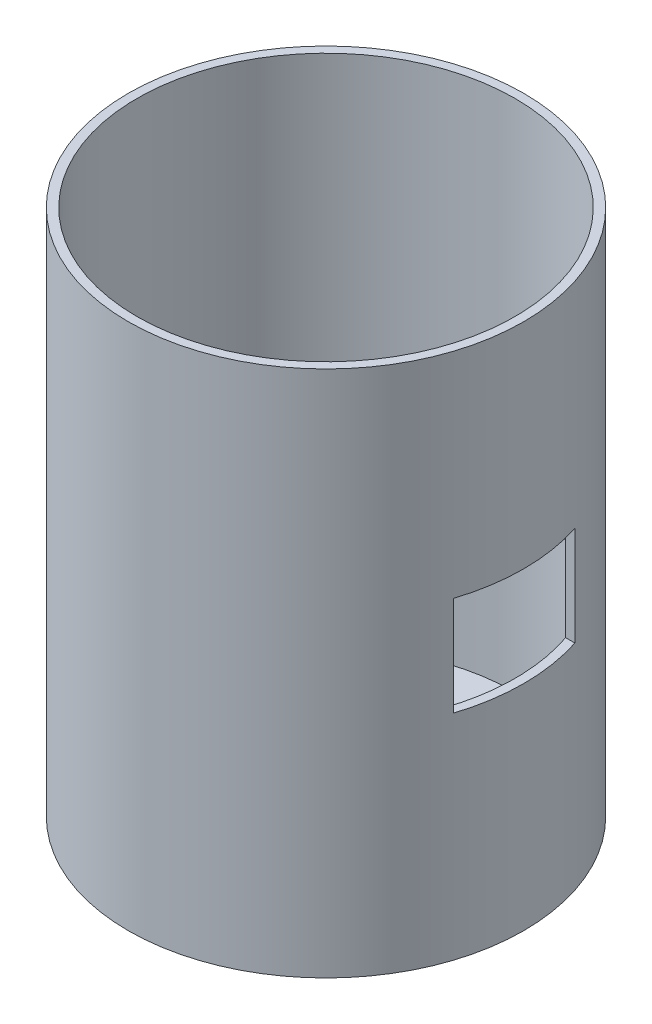
ISO-10303-21;
HEADER;
FILE_DESCRIPTION(('STEP AP214'),'2;1');
FILE_NAME('part.step','',(''),(''),'','','');
FILE_SCHEMA(('AUTOMOTIVE_DESIGN { 1 0 10303 214 1 1 1 1 }'));
ENDSEC;
DATA;
#1=APPLICATION_CONTEXT('core data for automotive mechanical design processes');
#2=APPLICATION_PROTOCOL_DEFINITION('international standard','automotive_design',2000,#1);
#3=PRODUCT_CONTEXT('',#1,'mechanical');
#4=PRODUCT('Part','Part','',(#3));
#5=PRODUCT_RELATED_PRODUCT_CATEGORY('part','',(#4));
#6=PRODUCT_DEFINITION_FORMATION('','',#4);
#7=PRODUCT_DEFINITION_CONTEXT('part definition',#1,'design');
#8=PRODUCT_DEFINITION('design','',#6,#7);
#9=PRODUCT_DEFINITION_SHAPE('','',#8);
#10=(LENGTH_UNIT() NAMED_UNIT(*) SI_UNIT(.MILLI.,.METRE.));
#11=(NAMED_UNIT(*) PLANE_ANGLE_UNIT() SI_UNIT($,.RADIAN.));
#12=(NAMED_UNIT(*) SI_UNIT($,.STERADIAN.) SOLID_ANGLE_UNIT());
#13=UNCERTAINTY_MEASURE_WITH_UNIT(LENGTH_MEASURE(1.E-05),#10,'distance_accuracy_value','');
#14=(GEOMETRIC_REPRESENTATION_CONTEXT(3) GLOBAL_UNCERTAINTY_ASSIGNED_CONTEXT((#13)) GLOBAL_UNIT_ASSIGNED_CONTEXT((#10,
#11,#12)) REPRESENTATION_CONTEXT('',''));
#15=CARTESIAN_POINT('',(0.,0.,0.));
#16=DIRECTION('',(0.,0.,1.));
#17=DIRECTION('',(1.,0.,0.));
#18=AXIS2_PLACEMENT_3D('',#15,#16,#17);
#19=CARTESIAN_POINT('',(0.,120.,0.));
#20=DIRECTION('',(0.,-1.,0.));
#21=DIRECTION('',(0.,0.,-1.));
#22=AXIS2_PLACEMENT_3D('',#19,#20,#21);
#23=CYLINDRICAL_SURFACE('',#22,45.);
#24=CARTESIAN_POINT('',(0.,0.,0.));
#25=DIRECTION('',(0.,1.,0.));
#26=DIRECTION('',(0.,0.,1.));
#27=AXIS2_PLACEMENT_3D('',#24,#25,#26);
#28=CIRCLE('',#27,45.);
#29=CARTESIAN_POINT('',(0.,0.,45.));
#30=VERTEX_POINT('',#29);
#31=EDGE_CURVE('E113',#30,#30,#28,.T.);
#32=ORIENTED_EDGE('',*,*,#31,.T.);
#33=EDGE_LOOP('',(#32));
#34=FACE_BOUND('',#33,.T.);
#35=CARTESIAN_POINT('',(0.,120.,0.));
#36=DIRECTION('',(0.,1.,0.));
#37=DIRECTION('',(0.,0.,1.));
#38=AXIS2_PLACEMENT_3D('',#35,#36,#37);
#39=CIRCLE('',#38,45.);
#40=CARTESIAN_POINT('',(0.,120.,45.));
#41=VERTEX_POINT('',#40);
#42=EDGE_CURVE('E120',#41,#41,#39,.T.);
#43=ORIENTED_EDGE('',*,*,#42,.F.);
#44=EDGE_LOOP('',(#43));
#45=FACE_BOUND('',#44,.T.);
#46=DIRECTION('',(0.,-1.,0.));
#47=VECTOR('',#46,1.);
#48=CARTESIAN_POINT('',(42.8317639141794,120.,13.8));
#49=LINE('',#48,#47);
#50=CARTESIAN_POINT('',(42.8317639141794,71.3,13.8));
#51=VERTEX_POINT('',#50);
#52=CARTESIAN_POINT('',(42.8317639141794,48.7,13.8));
#53=VERTEX_POINT('',#52);
#54=EDGE_CURVE('E94',#51,#53,#49,.T.);
#55=ORIENTED_EDGE('',*,*,#54,.F.);
#56=CARTESIAN_POINT('',(0.,71.3,0.));
#57=DIRECTION('',(0.,-1.,0.));
#58=DIRECTION('',(0.,0.,-1.));
#59=AXIS2_PLACEMENT_3D('',#56,#57,#58);
#60=CIRCLE('',#59,45.);
#61=CARTESIAN_POINT('',(42.8317639141794,71.3,-13.8));
#62=VERTEX_POINT('',#61);
#63=EDGE_CURVE('E82',#62,#51,#60,.T.);
#64=ORIENTED_EDGE('',*,*,#63,.F.);
#65=DIRECTION('',(0.,-1.,0.));
#66=VECTOR('',#65,1.);
#67=CARTESIAN_POINT('',(42.8317639141794,120.,-13.8));
#68=LINE('',#67,#66);
#69=CARTESIAN_POINT('',(42.8317639141794,48.7,-13.8));
#70=VERTEX_POINT('',#69);
#71=EDGE_CURVE('E86',#70,#62,#68,.F.);
#72=ORIENTED_EDGE('',*,*,#71,.F.);
#73=CARTESIAN_POINT('',(0.,48.7,0.));
#74=DIRECTION('',(0.,1.,0.));
#75=DIRECTION('',(0.,0.,1.));
#76=AXIS2_PLACEMENT_3D('',#73,#74,#75);
#77=CIRCLE('',#76,45.);
#78=EDGE_CURVE('E101',#53,#70,#77,.T.);
#79=ORIENTED_EDGE('',*,*,#78,.F.);
#80=EDGE_LOOP('',(#55,#64,#72,#79));
#81=FACE_BOUND('',#80,.T.);
#82=ADVANCED_FACE('F44',(#34,#45,#81),#23,.T.);
#83=CARTESIAN_POINT('',(0.,2.99999999999999,0.));
#84=DIRECTION('',(0.,1.,0.));
#85=DIRECTION('',(0.,0.,1.));
#86=AXIS2_PLACEMENT_3D('',#83,#84,#85);
#87=CYLINDRICAL_SURFACE('',#86,43.);
#88=CARTESIAN_POINT('',(0.,120.,0.));
#89=DIRECTION('',(0.,1.,0.));
#90=DIRECTION('',(0.,0.,1.));
#91=AXIS2_PLACEMENT_3D('',#88,#89,#90);
#92=CIRCLE('',#91,43.);
#93=CARTESIAN_POINT('',(0.,120.,43.));
#94=VERTEX_POINT('',#93);
#95=EDGE_CURVE('E103',#94,#94,#92,.T.);
#96=ORIENTED_EDGE('',*,*,#95,.T.);
#97=EDGE_LOOP('',(#96));
#98=FACE_BOUND('',#97,.T.);
#99=CARTESIAN_POINT('',(0.,2.99999999999999,0.));
#100=DIRECTION('',(0.,1.,0.));
#101=DIRECTION('',(0.,0.,1.));
#102=AXIS2_PLACEMENT_3D('',#99,#100,#101);
#103=CIRCLE('',#102,43.);
#104=CARTESIAN_POINT('',(0.,2.99999999999999,43.));
#105=VERTEX_POINT('',#104);
#106=EDGE_CURVE('E107',#105,#105,#103,.T.);
#107=ORIENTED_EDGE('',*,*,#106,.F.);
#108=EDGE_LOOP('',(#107));
#109=FACE_BOUND('',#108,.T.);
#110=DIRECTION('',(0.,1.,0.));
#111=VECTOR('',#110,1.);
#112=CARTESIAN_POINT('',(40.7254220358734,2.99999999999999,13.8));
#113=LINE('',#112,#111);
#114=CARTESIAN_POINT('',(40.7254220358734,48.7,13.8));
#115=VERTEX_POINT('',#114);
#116=CARTESIAN_POINT('',(40.7254220358734,71.3,13.8));
#117=VERTEX_POINT('',#116);
#118=EDGE_CURVE('E11',#115,#117,#113,.T.);
#119=ORIENTED_EDGE('',*,*,#118,.F.);
#120=CARTESIAN_POINT('',(0.,48.7,0.));
#121=DIRECTION('',(0.,1.,0.));
#122=DIRECTION('',(0.,0.,1.));
#123=AXIS2_PLACEMENT_3D('',#120,#121,#122);
#124=CIRCLE('',#123,43.);
#125=CARTESIAN_POINT('',(40.7254220358734,48.7,-13.8));
#126=VERTEX_POINT('',#125);
#127=EDGE_CURVE('E52',#126,#115,#124,.F.);
#128=ORIENTED_EDGE('',*,*,#127,.F.);
#129=DIRECTION('',(0.,1.,0.));
#130=VECTOR('',#129,1.);
#131=CARTESIAN_POINT('',(40.7254220358734,2.99999999999999,-13.8));
#132=LINE('',#131,#130);
#133=CARTESIAN_POINT('',(40.7254220358734,71.3,-13.8));
#134=VERTEX_POINT('',#133);
#135=EDGE_CURVE('E130',#134,#126,#132,.F.);
#136=ORIENTED_EDGE('',*,*,#135,.F.);
#137=CARTESIAN_POINT('',(0.,71.3,0.));
#138=DIRECTION('',(0.,-1.,0.));
#139=DIRECTION('',(0.,0.,-1.));
#140=AXIS2_PLACEMENT_3D('',#137,#138,#139);
#141=CIRCLE('',#140,43.);
#142=EDGE_CURVE('E121',#117,#134,#141,.F.);
#143=ORIENTED_EDGE('',*,*,#142,.F.);
#144=EDGE_LOOP('',(#119,#128,#136,#143));
#145=FACE_BOUND('',#144,.T.);
#146=ADVANCED_FACE('F140',(#98,#109,#145),#87,.F.);
#147=CARTESIAN_POINT('',(0.,120.,0.));
#148=DIRECTION('',(0.,1.,0.));
#149=DIRECTION('',(0.,0.,1.));
#150=AXIS2_PLACEMENT_3D('',#147,#148,#149);
#151=PLANE('',#150);
#152=ORIENTED_EDGE('',*,*,#95,.F.);
#153=EDGE_LOOP('',(#152));
#154=FACE_BOUND('',#153,.T.);
#155=ORIENTED_EDGE('',*,*,#42,.T.);
#156=EDGE_LOOP('',(#155));
#157=FACE_BOUND('',#156,.T.);
#158=ADVANCED_FACE('F165',(#154,#157),#151,.T.);
#159=CARTESIAN_POINT('',(0.,0.,0.));
#160=DIRECTION('',(0.,1.,0.));
#161=DIRECTION('',(0.,0.,1.));
#162=AXIS2_PLACEMENT_3D('',#159,#160,#161);
#163=PLANE('',#162);
#164=ORIENTED_EDGE('',*,*,#31,.F.);
#165=EDGE_LOOP('',(#164));
#166=FACE_BOUND('',#165,.T.);
#167=ADVANCED_FACE('F168',(#166),#163,.F.);
#168=CARTESIAN_POINT('',(0.,2.99999999999999,0.));
#169=DIRECTION('',(0.,1.,0.));
#170=DIRECTION('',(0.,0.,1.));
#171=AXIS2_PLACEMENT_3D('',#168,#169,#170);
#172=PLANE('',#171);
#173=ORIENTED_EDGE('',*,*,#106,.T.);
#174=EDGE_LOOP('',(#173));
#175=FACE_BOUND('',#174,.T.);
#176=ADVANCED_FACE('F176',(#175),#172,.T.);
#177=CARTESIAN_POINT('',(50.,71.3,13.8));
#178=DIRECTION('',(0.,0.,-1.));
#179=DIRECTION('',(-1.,0.,0.));
#180=AXIS2_PLACEMENT_3D('',#177,#178,#179);
#181=PLANE('',#180);
#182=ORIENTED_EDGE('',*,*,#54,.T.);
#183=DIRECTION('',(-1.,0.,0.));
#184=VECTOR('',#183,1.);
#185=CARTESIAN_POINT('',(50.,48.7,13.8));
#186=LINE('',#185,#184);
#187=EDGE_CURVE('E90',#53,#115,#186,.T.);
#188=ORIENTED_EDGE('',*,*,#187,.T.);
#189=ORIENTED_EDGE('',*,*,#118,.T.);
#190=DIRECTION('',(-1.,0.,0.));
#191=VECTOR('',#190,1.);
#192=CARTESIAN_POINT('',(50.,71.3,13.8));
#193=LINE('',#192,#191);
#194=EDGE_CURVE('E64',#51,#117,#193,.T.);
#195=ORIENTED_EDGE('',*,*,#194,.F.);
#196=EDGE_LOOP('',(#182,#188,#189,#195));
#197=FACE_BOUND('',#196,.T.);
#198=ADVANCED_FACE('F95',(#197),#181,.T.);
#199=CARTESIAN_POINT('',(50.,48.7,13.8));
#200=DIRECTION('',(0.,1.,0.));
#201=DIRECTION('',(0.,0.,1.));
#202=AXIS2_PLACEMENT_3D('',#199,#200,#201);
#203=PLANE('',#202);
#204=ORIENTED_EDGE('',*,*,#78,.T.);
#205=DIRECTION('',(-1.,0.,0.));
#206=VECTOR('',#205,1.);
#207=CARTESIAN_POINT('',(50.,48.7,-13.8));
#208=LINE('',#207,#206);
#209=EDGE_CURVE('E134',#70,#126,#208,.T.);
#210=ORIENTED_EDGE('',*,*,#209,.T.);
#211=ORIENTED_EDGE('',*,*,#127,.T.);
#212=ORIENTED_EDGE('',*,*,#187,.F.);
#213=EDGE_LOOP('',(#204,#210,#211,#212));
#214=FACE_BOUND('',#213,.T.);
#215=ADVANCED_FACE('F132',(#214),#203,.T.);
#216=CARTESIAN_POINT('',(50.,48.7,-13.8));
#217=DIRECTION('',(0.,0.,1.));
#218=DIRECTION('',(1.,0.,0.));
#219=AXIS2_PLACEMENT_3D('',#216,#217,#218);
#220=PLANE('',#219);
#221=ORIENTED_EDGE('',*,*,#71,.T.);
#222=DIRECTION('',(-1.,0.,0.));
#223=VECTOR('',#222,1.);
#224=CARTESIAN_POINT('',(50.,71.3,-13.8));
#225=LINE('',#224,#223);
#226=EDGE_CURVE('E58',#62,#134,#225,.T.);
#227=ORIENTED_EDGE('',*,*,#226,.T.);
#228=ORIENTED_EDGE('',*,*,#135,.T.);
#229=ORIENTED_EDGE('',*,*,#209,.F.);
#230=EDGE_LOOP('',(#221,#227,#228,#229));
#231=FACE_BOUND('',#230,.T.);
#232=ADVANCED_FACE('F142',(#231),#220,.T.);
#233=CARTESIAN_POINT('',(50.,71.3,-13.8));
#234=DIRECTION('',(0.,-1.,0.));
#235=DIRECTION('',(0.,0.,-1.));
#236=AXIS2_PLACEMENT_3D('',#233,#234,#235);
#237=PLANE('',#236);
#238=ORIENTED_EDGE('',*,*,#63,.T.);
#239=ORIENTED_EDGE('',*,*,#194,.T.);
#240=ORIENTED_EDGE('',*,*,#142,.T.);
#241=ORIENTED_EDGE('',*,*,#226,.F.);
#242=EDGE_LOOP('',(#238,#239,#240,#241));
#243=FACE_BOUND('',#242,.T.);
#244=ADVANCED_FACE('F84',(#243),#237,.T.);
#245=CLOSED_SHELL('',(#82,#146,#158,#167,#176,#198,#215,#232,#244));
#246=MANIFOLD_SOLID_BREP('B2',#245);
#247=ADVANCED_BREP_SHAPE_REPRESENTATION('',(#18,#246),#14);
#248=SHAPE_DEFINITION_REPRESENTATION(#9,#247);
ENDSEC;
END-ISO-10303-21;
